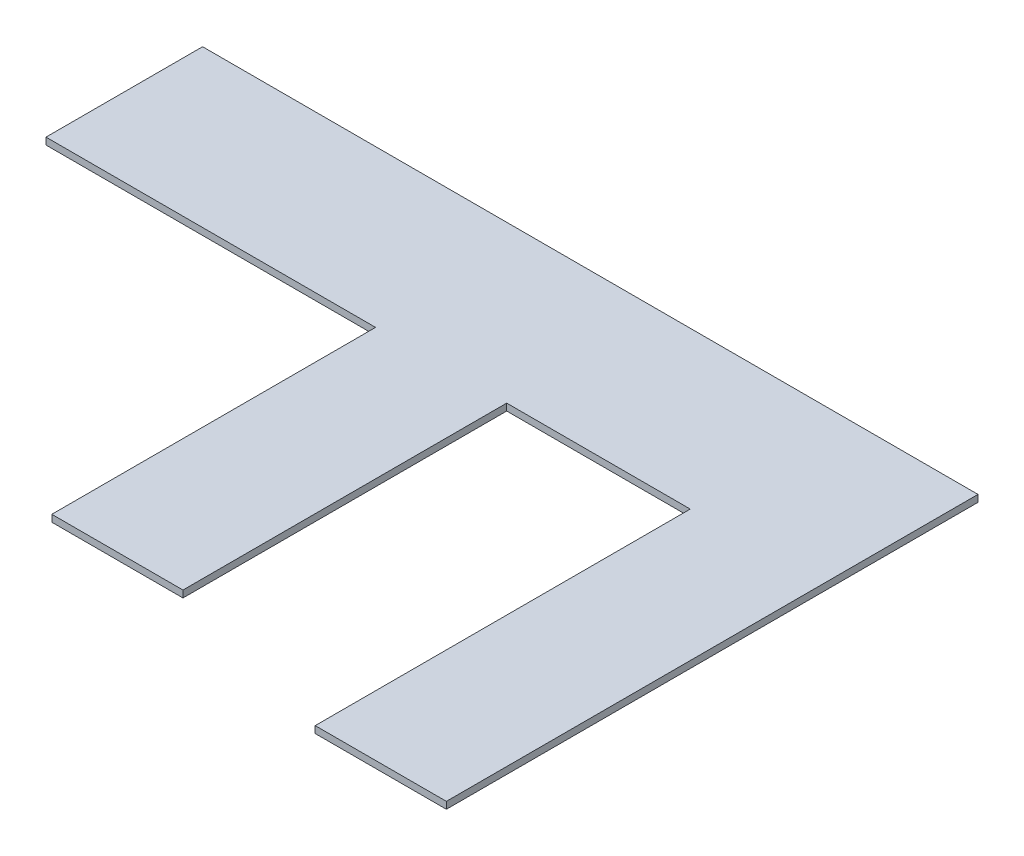
ISO-10303-21;
HEADER;
FILE_DESCRIPTION(('STEP AP214'),'2;1');
FILE_NAME('part.step','',(''),(''),'','','');
FILE_SCHEMA(('AUTOMOTIVE_DESIGN { 1 0 10303 214 1 1 1 1 }'));
ENDSEC;
DATA;
#1=APPLICATION_CONTEXT('core data for automotive mechanical design processes');
#2=APPLICATION_PROTOCOL_DEFINITION('international standard','automotive_design',2000,#1);
#3=PRODUCT_CONTEXT('',#1,'mechanical');
#4=PRODUCT('Part','Part','',(#3));
#5=PRODUCT_RELATED_PRODUCT_CATEGORY('part','',(#4));
#6=PRODUCT_DEFINITION_FORMATION('','',#4);
#7=PRODUCT_DEFINITION_CONTEXT('part definition',#1,'design');
#8=PRODUCT_DEFINITION('design','',#6,#7);
#9=PRODUCT_DEFINITION_SHAPE('','',#8);
#10=(LENGTH_UNIT() NAMED_UNIT(*) SI_UNIT(.MILLI.,.METRE.));
#11=(NAMED_UNIT(*) PLANE_ANGLE_UNIT() SI_UNIT($,.RADIAN.));
#12=(NAMED_UNIT(*) SI_UNIT($,.STERADIAN.) SOLID_ANGLE_UNIT());
#13=UNCERTAINTY_MEASURE_WITH_UNIT(LENGTH_MEASURE(1.E-05),#10,'distance_accuracy_value','');
#14=(GEOMETRIC_REPRESENTATION_CONTEXT(3) GLOBAL_UNCERTAINTY_ASSIGNED_CONTEXT((#13)) GLOBAL_UNIT_ASSIGNED_CONTEXT((#10,
#11,#12)) REPRESENTATION_CONTEXT('',''));
#15=CARTESIAN_POINT('',(0.,0.,0.));
#16=DIRECTION('',(0.,0.,1.));
#17=DIRECTION('',(1.,0.,0.));
#18=AXIS2_PLACEMENT_3D('',#15,#16,#17);
#19=CARTESIAN_POINT('',(-8.631267976045,2.15,0.));
#20=DIRECTION('',(0.,1.,0.));
#21=DIRECTION('',(0.,0.,1.));
#22=AXIS2_PLACEMENT_3D('',#19,#20,#21);
#23=PLANE('',#22);
#24=DIRECTION('',(-1.,0.,0.));
#25=VECTOR('',#24,1.);
#26=CARTESIAN_POINT('',(-8.631267976045,2.15,-2.65692056047));
#27=LINE('',#26,#25);
#28=CARTESIAN_POINT('',(-1.195237861878,2.15,-2.65692056047));
#29=VERTEX_POINT('',#28);
#30=CARTESIAN_POINT('',(-2.319545515188,2.15,-2.65692056047));
#31=VERTEX_POINT('',#30);
#32=EDGE_CURVE('E151',#29,#31,#27,.T.);
#33=ORIENTED_EDGE('',*,*,#32,.F.);
#34=DIRECTION('',(0.,0.,-1.));
#35=VECTOR('',#34,1.);
#36=CARTESIAN_POINT('',(-1.195237861878,2.15,0.));
#37=LINE('',#36,#35);
#38=CARTESIAN_POINT('',(-1.195237861878,2.15,-1.886079937126));
#39=VERTEX_POINT('',#38);
#40=EDGE_CURVE('E146',#39,#29,#37,.T.);
#41=ORIENTED_EDGE('',*,*,#40,.F.);
#42=DIRECTION('',(1.,0.,0.));
#43=VECTOR('',#42,1.);
#44=CARTESIAN_POINT('',(-8.631267976045,2.15,-1.886079937126));
#45=LINE('',#44,#43);
#46=CARTESIAN_POINT('',(-1.385407258117,2.15,-1.886079937126));
#47=VERTEX_POINT('',#46);
#48=EDGE_CURVE('E140',#47,#39,#45,.T.);
#49=ORIENTED_EDGE('',*,*,#48,.F.);
#50=DIRECTION('',(0.,0.,1.));
#51=VECTOR('',#50,1.);
#52=CARTESIAN_POINT('',(-1.385407258117,2.15,0.));
#53=LINE('',#52,#51);
#54=CARTESIAN_POINT('',(-1.385407258117,2.15,-2.429888618221));
#55=VERTEX_POINT('',#54);
#56=EDGE_CURVE('E134',#55,#47,#53,.T.);
#57=ORIENTED_EDGE('',*,*,#56,.F.);
#58=DIRECTION('',(1.,0.,0.));
#59=VECTOR('',#58,1.);
#60=CARTESIAN_POINT('',(-8.631267976045,2.15,-2.429888618221));
#61=LINE('',#60,#59);
#62=CARTESIAN_POINT('',(-1.65154105992,2.15,-2.429888618221));
#63=VERTEX_POINT('',#62);
#64=EDGE_CURVE('E128',#63,#55,#61,.T.);
#65=ORIENTED_EDGE('',*,*,#64,.F.);
#66=DIRECTION('',(0.,0.,-1.));
#67=VECTOR('',#66,1.);
#68=CARTESIAN_POINT('',(-1.65154105992,2.15,0.));
#69=LINE('',#68,#67);
#70=CARTESIAN_POINT('',(-1.65154105992,2.15,-1.960494048698));
#71=VERTEX_POINT('',#70);
#72=EDGE_CURVE('E122',#71,#63,#69,.T.);
#73=ORIENTED_EDGE('',*,*,#72,.F.);
#74=DIRECTION('',(1.,0.,0.));
#75=VECTOR('',#74,1.);
#76=CARTESIAN_POINT('',(-8.631267976045,2.15,-1.960494048698));
#77=LINE('',#76,#75);
#78=CARTESIAN_POINT('',(-1.841710456159,2.15,-1.960494048698));
#79=VERTEX_POINT('',#78);
#80=EDGE_CURVE('E116',#79,#71,#77,.T.);
#81=ORIENTED_EDGE('',*,*,#80,.F.);
#82=DIRECTION('',(0.,0.,1.));
#83=VECTOR('',#82,1.);
#84=CARTESIAN_POINT('',(-1.841710456159,2.15,0.));
#85=LINE('',#84,#83);
#86=CARTESIAN_POINT('',(-1.841710456159,2.15,-2.429888618221));
#87=VERTEX_POINT('',#86);
#88=EDGE_CURVE('E92',#87,#79,#85,.T.);
#89=ORIENTED_EDGE('',*,*,#88,.F.);
#90=DIRECTION('',(1.,0.,0.));
#91=VECTOR('',#90,1.);
#92=CARTESIAN_POINT('',(-8.631267976045,2.15,-2.429888618221));
#93=LINE('',#92,#91);
#94=CARTESIAN_POINT('',(-2.319545515188,2.15,-2.429888618221));
#95=VERTEX_POINT('',#94);
#96=EDGE_CURVE('E94',#95,#87,#93,.T.);
#97=ORIENTED_EDGE('',*,*,#96,.F.);
#98=DIRECTION('',(0.,0.,1.));
#99=VECTOR('',#98,1.);
#100=CARTESIAN_POINT('',(-2.319545515188,2.15,0.));
#101=LINE('',#100,#99);
#102=EDGE_CURVE('E20',#31,#95,#101,.T.);
#103=ORIENTED_EDGE('',*,*,#102,.F.);
#104=EDGE_LOOP('',(#33,#41,#49,#57,#65,#73,#81,#89,#97,#103));
#105=FACE_BOUND('',#104,.T.);
#106=ADVANCED_FACE('F17',(#105),#23,.F.);
#107=CARTESIAN_POINT('',(-2.319545515188,2.16,0.));
#108=DIRECTION('',(-1.,0.,0.));
#109=DIRECTION('',(0.,0.,1.));
#110=AXIS2_PLACEMENT_3D('',#107,#108,#109);
#111=PLANE('',#110);
#112=DIRECTION('',(0.,0.,1.));
#113=VECTOR('',#112,1.);
#114=CARTESIAN_POINT('',(-2.319545515188,2.16,0.));
#115=LINE('',#114,#113);
#116=CARTESIAN_POINT('',(-2.319545515188,2.16,-2.65692056047));
#117=VERTEX_POINT('',#116);
#118=CARTESIAN_POINT('',(-2.319545515188,2.16,-2.429888618221));
#119=VERTEX_POINT('',#118);
#120=EDGE_CURVE('E155',#117,#119,#115,.T.);
#121=ORIENTED_EDGE('',*,*,#120,.F.);
#122=DIRECTION('',(0.,1.,0.));
#123=VECTOR('',#122,1.);
#124=CARTESIAN_POINT('',(-2.319545515188,2.16,-2.65692056047));
#125=LINE('',#124,#123);
#126=EDGE_CURVE('E105',#31,#117,#125,.T.);
#127=ORIENTED_EDGE('',*,*,#126,.F.);
#128=ORIENTED_EDGE('',*,*,#102,.T.);
#129=DIRECTION('',(0.,1.,0.));
#130=VECTOR('',#129,1.);
#131=CARTESIAN_POINT('',(-2.319545515188,2.16,-2.429888618221));
#132=LINE('',#131,#130);
#133=EDGE_CURVE('E100',#119,#95,#132,.F.);
#134=ORIENTED_EDGE('',*,*,#133,.F.);
#135=EDGE_LOOP('',(#121,#127,#128,#134));
#136=FACE_BOUND('',#135,.T.);
#137=ADVANCED_FACE('F102',(#136),#111,.T.);
#138=CARTESIAN_POINT('',(-8.631267976045,2.16,-2.429888618221));
#139=DIRECTION('',(0.,0.,1.));
#140=DIRECTION('',(1.,0.,0.));
#141=AXIS2_PLACEMENT_3D('',#138,#139,#140);
#142=PLANE('',#141);
#143=DIRECTION('',(1.,0.,0.));
#144=VECTOR('',#143,1.);
#145=CARTESIAN_POINT('',(-8.631267976045,2.16,-2.429888618221));
#146=LINE('',#145,#144);
#147=CARTESIAN_POINT('',(-1.841710456159,2.16,-2.429888618221));
#148=VERTEX_POINT('',#147);
#149=EDGE_CURVE('E109',#119,#148,#146,.T.);
#150=ORIENTED_EDGE('',*,*,#149,.F.);
#151=ORIENTED_EDGE('',*,*,#133,.T.);
#152=ORIENTED_EDGE('',*,*,#96,.T.);
#153=DIRECTION('',(0.,1.,0.));
#154=VECTOR('',#153,1.);
#155=CARTESIAN_POINT('',(-1.841710456159,2.16,-2.429888618221));
#156=LINE('',#155,#154);
#157=EDGE_CURVE('E112',#148,#87,#156,.F.);
#158=ORIENTED_EDGE('',*,*,#157,.F.);
#159=EDGE_LOOP('',(#150,#151,#152,#158));
#160=FACE_BOUND('',#159,.T.);
#161=ADVANCED_FACE('F107',(#160),#142,.T.);
#162=CARTESIAN_POINT('',(-1.841710456159,2.16,0.));
#163=DIRECTION('',(-1.,0.,0.));
#164=DIRECTION('',(0.,0.,1.));
#165=AXIS2_PLACEMENT_3D('',#162,#163,#164);
#166=PLANE('',#165);
#167=DIRECTION('',(0.,0.,1.));
#168=VECTOR('',#167,1.);
#169=CARTESIAN_POINT('',(-1.841710456159,2.16,0.));
#170=LINE('',#169,#168);
#171=CARTESIAN_POINT('',(-1.841710456159,2.16,-1.960494048698));
#172=VERTEX_POINT('',#171);
#173=EDGE_CURVE('E158',#148,#172,#170,.T.);
#174=ORIENTED_EDGE('',*,*,#173,.F.);
#175=ORIENTED_EDGE('',*,*,#157,.T.);
#176=ORIENTED_EDGE('',*,*,#88,.T.);
#177=DIRECTION('',(0.,1.,0.));
#178=VECTOR('',#177,1.);
#179=CARTESIAN_POINT('',(-1.841710456159,2.16,-1.960494048698));
#180=LINE('',#179,#178);
#181=EDGE_CURVE('E119',#172,#79,#180,.F.);
#182=ORIENTED_EDGE('',*,*,#181,.F.);
#183=EDGE_LOOP('',(#174,#175,#176,#182));
#184=FACE_BOUND('',#183,.T.);
#185=ADVANCED_FACE('F197',(#184),#166,.T.);
#186=CARTESIAN_POINT('',(-8.631267976045,2.16,-1.960494048698));
#187=DIRECTION('',(0.,0.,1.));
#188=DIRECTION('',(1.,0.,0.));
#189=AXIS2_PLACEMENT_3D('',#186,#187,#188);
#190=PLANE('',#189);
#191=DIRECTION('',(1.,0.,0.));
#192=VECTOR('',#191,1.);
#193=CARTESIAN_POINT('',(-8.631267976045,2.16,-1.960494048698));
#194=LINE('',#193,#192);
#195=CARTESIAN_POINT('',(-1.65154105992,2.16,-1.960494048698));
#196=VERTEX_POINT('',#195);
#197=EDGE_CURVE('E161',#172,#196,#194,.T.);
#198=ORIENTED_EDGE('',*,*,#197,.F.);
#199=ORIENTED_EDGE('',*,*,#181,.T.);
#200=ORIENTED_EDGE('',*,*,#80,.T.);
#201=DIRECTION('',(0.,1.,0.));
#202=VECTOR('',#201,1.);
#203=CARTESIAN_POINT('',(-1.65154105992,2.16,-1.960494048698));
#204=LINE('',#203,#202);
#205=EDGE_CURVE('E125',#196,#71,#204,.F.);
#206=ORIENTED_EDGE('',*,*,#205,.F.);
#207=EDGE_LOOP('',(#198,#199,#200,#206));
#208=FACE_BOUND('',#207,.T.);
#209=ADVANCED_FACE('F194',(#208),#190,.T.);
#210=CARTESIAN_POINT('',(-1.65154105992,2.16,0.));
#211=DIRECTION('',(1.,0.,0.));
#212=DIRECTION('',(0.,0.,-1.));
#213=AXIS2_PLACEMENT_3D('',#210,#211,#212);
#214=PLANE('',#213);
#215=DIRECTION('',(0.,0.,1.));
#216=VECTOR('',#215,1.);
#217=CARTESIAN_POINT('',(-1.65154105992,2.16,0.));
#218=LINE('',#217,#216);
#219=CARTESIAN_POINT('',(-1.65154105992,2.16,-2.429888618221));
#220=VERTEX_POINT('',#219);
#221=EDGE_CURVE('E164',#196,#220,#218,.F.);
#222=ORIENTED_EDGE('',*,*,#221,.F.);
#223=ORIENTED_EDGE('',*,*,#205,.T.);
#224=ORIENTED_EDGE('',*,*,#72,.T.);
#225=DIRECTION('',(0.,1.,0.));
#226=VECTOR('',#225,1.);
#227=CARTESIAN_POINT('',(-1.65154105992,2.16,-2.429888618221));
#228=LINE('',#227,#226);
#229=EDGE_CURVE('E131',#220,#63,#228,.F.);
#230=ORIENTED_EDGE('',*,*,#229,.F.);
#231=EDGE_LOOP('',(#222,#223,#224,#230));
#232=FACE_BOUND('',#231,.T.);
#233=ADVANCED_FACE('F191',(#232),#214,.T.);
#234=CARTESIAN_POINT('',(-8.631267976045,2.16,-2.429888618221));
#235=DIRECTION('',(0.,0.,1.));
#236=DIRECTION('',(1.,0.,0.));
#237=AXIS2_PLACEMENT_3D('',#234,#235,#236);
#238=PLANE('',#237);
#239=DIRECTION('',(1.,0.,0.));
#240=VECTOR('',#239,1.);
#241=CARTESIAN_POINT('',(-8.631267976045,2.16,-2.429888618221));
#242=LINE('',#241,#240);
#243=CARTESIAN_POINT('',(-1.385407258117,2.16,-2.429888618221));
#244=VERTEX_POINT('',#243);
#245=EDGE_CURVE('E167',#220,#244,#242,.T.);
#246=ORIENTED_EDGE('',*,*,#245,.F.);
#247=ORIENTED_EDGE('',*,*,#229,.T.);
#248=ORIENTED_EDGE('',*,*,#64,.T.);
#249=DIRECTION('',(0.,1.,0.));
#250=VECTOR('',#249,1.);
#251=CARTESIAN_POINT('',(-1.385407258117,2.16,-2.429888618221));
#252=LINE('',#251,#250);
#253=EDGE_CURVE('E137',#244,#55,#252,.F.);
#254=ORIENTED_EDGE('',*,*,#253,.F.);
#255=EDGE_LOOP('',(#246,#247,#248,#254));
#256=FACE_BOUND('',#255,.T.);
#257=ADVANCED_FACE('F188',(#256),#238,.T.);
#258=CARTESIAN_POINT('',(-1.385407258117,2.16,0.));
#259=DIRECTION('',(-1.,0.,0.));
#260=DIRECTION('',(0.,0.,1.));
#261=AXIS2_PLACEMENT_3D('',#258,#259,#260);
#262=PLANE('',#261);
#263=DIRECTION('',(0.,0.,1.));
#264=VECTOR('',#263,1.);
#265=CARTESIAN_POINT('',(-1.385407258117,2.16,0.));
#266=LINE('',#265,#264);
#267=CARTESIAN_POINT('',(-1.385407258117,2.16,-1.886079937126));
#268=VERTEX_POINT('',#267);
#269=EDGE_CURVE('E170',#244,#268,#266,.T.);
#270=ORIENTED_EDGE('',*,*,#269,.F.);
#271=ORIENTED_EDGE('',*,*,#253,.T.);
#272=ORIENTED_EDGE('',*,*,#56,.T.);
#273=DIRECTION('',(0.,1.,0.));
#274=VECTOR('',#273,1.);
#275=CARTESIAN_POINT('',(-1.385407258117,2.16,-1.886079937126));
#276=LINE('',#275,#274);
#277=EDGE_CURVE('E143',#268,#47,#276,.F.);
#278=ORIENTED_EDGE('',*,*,#277,.F.);
#279=EDGE_LOOP('',(#270,#271,#272,#278));
#280=FACE_BOUND('',#279,.T.);
#281=ADVANCED_FACE('F185',(#280),#262,.T.);
#282=CARTESIAN_POINT('',(-8.631267976045,2.16,-1.886079937126));
#283=DIRECTION('',(0.,0.,1.));
#284=DIRECTION('',(1.,0.,0.));
#285=AXIS2_PLACEMENT_3D('',#282,#283,#284);
#286=PLANE('',#285);
#287=DIRECTION('',(1.,0.,0.));
#288=VECTOR('',#287,1.);
#289=CARTESIAN_POINT('',(-8.631267976045,2.16,-1.886079937126));
#290=LINE('',#289,#288);
#291=CARTESIAN_POINT('',(-1.195237861878,2.16,-1.886079937126));
#292=VERTEX_POINT('',#291);
#293=EDGE_CURVE('E173',#268,#292,#290,.T.);
#294=ORIENTED_EDGE('',*,*,#293,.F.);
#295=ORIENTED_EDGE('',*,*,#277,.T.);
#296=ORIENTED_EDGE('',*,*,#48,.T.);
#297=DIRECTION('',(0.,1.,0.));
#298=VECTOR('',#297,1.);
#299=CARTESIAN_POINT('',(-1.195237861878,2.16,-1.886079937126));
#300=LINE('',#299,#298);
#301=EDGE_CURVE('E148',#292,#39,#300,.F.);
#302=ORIENTED_EDGE('',*,*,#301,.F.);
#303=EDGE_LOOP('',(#294,#295,#296,#302));
#304=FACE_BOUND('',#303,.T.);
#305=ADVANCED_FACE('F182',(#304),#286,.T.);
#306=CARTESIAN_POINT('',(-1.195237861878,2.16,0.));
#307=DIRECTION('',(1.,0.,0.));
#308=DIRECTION('',(0.,0.,-1.));
#309=AXIS2_PLACEMENT_3D('',#306,#307,#308);
#310=PLANE('',#309);
#311=DIRECTION('',(0.,0.,1.));
#312=VECTOR('',#311,1.);
#313=CARTESIAN_POINT('',(-1.195237861878,2.16,0.));
#314=LINE('',#313,#312);
#315=CARTESIAN_POINT('',(-1.195237861878,2.16,-2.65692056047));
#316=VERTEX_POINT('',#315);
#317=EDGE_CURVE('E26',#292,#316,#314,.F.);
#318=ORIENTED_EDGE('',*,*,#317,.F.);
#319=ORIENTED_EDGE('',*,*,#301,.T.);
#320=ORIENTED_EDGE('',*,*,#40,.T.);
#321=DIRECTION('',(0.,1.,0.));
#322=VECTOR('',#321,1.);
#323=CARTESIAN_POINT('',(-1.195237861878,2.16,-2.65692056047));
#324=LINE('',#323,#322);
#325=EDGE_CURVE('E35',#316,#29,#324,.F.);
#326=ORIENTED_EDGE('',*,*,#325,.F.);
#327=EDGE_LOOP('',(#318,#319,#320,#326));
#328=FACE_BOUND('',#327,.T.);
#329=ADVANCED_FACE('F180',(#328),#310,.T.);
#330=CARTESIAN_POINT('',(-8.631267976045,2.16,-2.65692056047));
#331=DIRECTION('',(0.,0.,-1.));
#332=DIRECTION('',(-1.,0.,0.));
#333=AXIS2_PLACEMENT_3D('',#330,#331,#332);
#334=PLANE('',#333);
#335=DIRECTION('',(1.,0.,0.));
#336=VECTOR('',#335,1.);
#337=CARTESIAN_POINT('',(-8.631267976045,2.16,-2.65692056047));
#338=LINE('',#337,#336);
#339=EDGE_CURVE('E11',#316,#117,#338,.F.);
#340=ORIENTED_EDGE('',*,*,#339,.F.);
#341=ORIENTED_EDGE('',*,*,#325,.T.);
#342=ORIENTED_EDGE('',*,*,#32,.T.);
#343=ORIENTED_EDGE('',*,*,#126,.T.);
#344=EDGE_LOOP('',(#340,#341,#342,#343));
#345=FACE_BOUND('',#344,.T.);
#346=ADVANCED_FACE('F199',(#345),#334,.T.);
#347=CARTESIAN_POINT('',(-8.631267976045,2.16,0.));
#348=DIRECTION('',(0.,1.,0.));
#349=DIRECTION('',(0.,0.,1.));
#350=AXIS2_PLACEMENT_3D('',#347,#348,#349);
#351=PLANE('',#350);
#352=ORIENTED_EDGE('',*,*,#317,.T.);
#353=ORIENTED_EDGE('',*,*,#339,.T.);
#354=ORIENTED_EDGE('',*,*,#120,.T.);
#355=ORIENTED_EDGE('',*,*,#149,.T.);
#356=ORIENTED_EDGE('',*,*,#173,.T.);
#357=ORIENTED_EDGE('',*,*,#197,.T.);
#358=ORIENTED_EDGE('',*,*,#221,.T.);
#359=ORIENTED_EDGE('',*,*,#245,.T.);
#360=ORIENTED_EDGE('',*,*,#269,.T.);
#361=ORIENTED_EDGE('',*,*,#293,.T.);
#362=EDGE_LOOP('',(#352,#353,#354,#355,#356,#357,#358,#359,#360,#361));
#363=FACE_BOUND('',#362,.T.);
#364=ADVANCED_FACE('F178',(#363),#351,.T.);
#365=CLOSED_SHELL('',(#106,#137,#161,#185,#209,#233,#257,#281,#305,#329,#346,#364));
#366=MANIFOLD_SOLID_BREP('B1',#365);
#367=ADVANCED_BREP_SHAPE_REPRESENTATION('',(#18,#366),#14);
#368=SHAPE_DEFINITION_REPRESENTATION(#9,#367);
ENDSEC;
END-ISO-10303-21;
